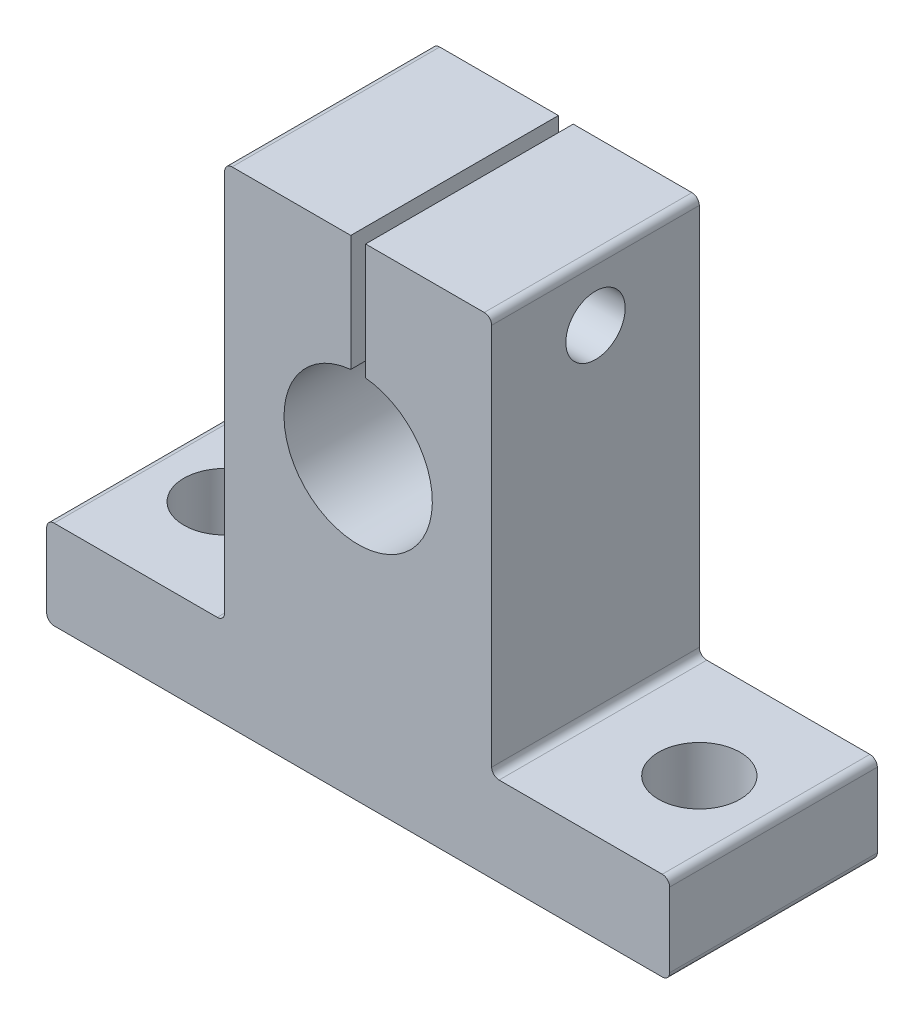
ISO-10303-21;
HEADER;
FILE_DESCRIPTION(('STEP AP214'),'2;1');
FILE_NAME('part.step','',(''),(''),'','','');
FILE_SCHEMA(('AUTOMOTIVE_DESIGN { 1 0 10303 214 1 1 1 1 }'));
ENDSEC;
DATA;
#1=APPLICATION_CONTEXT('core data for automotive mechanical design processes');
#2=APPLICATION_PROTOCOL_DEFINITION('international standard','automotive_design',2000,#1);
#3=PRODUCT_CONTEXT('',#1,'mechanical');
#4=PRODUCT('Part','Part','',(#3));
#5=PRODUCT_RELATED_PRODUCT_CATEGORY('part','',(#4));
#6=PRODUCT_DEFINITION_FORMATION('','',#4);
#7=PRODUCT_DEFINITION_CONTEXT('part definition',#1,'design');
#8=PRODUCT_DEFINITION('design','',#6,#7);
#9=PRODUCT_DEFINITION_SHAPE('','',#8);
#10=(LENGTH_UNIT() NAMED_UNIT(*) SI_UNIT(.MILLI.,.METRE.));
#11=(NAMED_UNIT(*) PLANE_ANGLE_UNIT() SI_UNIT($,.RADIAN.));
#12=(NAMED_UNIT(*) SI_UNIT($,.STERADIAN.) SOLID_ANGLE_UNIT());
#13=UNCERTAINTY_MEASURE_WITH_UNIT(LENGTH_MEASURE(1.E-05),#10,'distance_accuracy_value','');
#14=(GEOMETRIC_REPRESENTATION_CONTEXT(3) GLOBAL_UNCERTAINTY_ASSIGNED_CONTEXT((#13)) GLOBAL_UNIT_ASSIGNED_CONTEXT((#10,
#11,#12)) REPRESENTATION_CONTEXT('',''));
#15=CARTESIAN_POINT('',(0.,0.,0.));
#16=DIRECTION('',(0.,0.,1.));
#17=DIRECTION('',(1.,0.,0.));
#18=AXIS2_PLACEMENT_3D('',#15,#16,#17);
#19=CARTESIAN_POINT('',(0.5,13.4,7.));
#20=DIRECTION('',(0.,-1.,0.));
#21=DIRECTION('',(1.,0.,0.));
#22=AXIS2_PLACEMENT_3D('',#19,#20,#21);
#23=PLANE('',#22);
#24=DIRECTION('',(-1.,0.,0.));
#25=VECTOR('',#24,1.);
#26=CARTESIAN_POINT('',(0.5,13.4,7.));
#27=LINE('',#26,#25);
#28=CARTESIAN_POINT('',(8.5,13.4,7.));
#29=VERTEX_POINT('',#28);
#30=CARTESIAN_POINT('',(0.5,13.4,7.));
#31=VERTEX_POINT('',#30);
#32=EDGE_CURVE('E176',#29,#31,#27,.T.);
#33=ORIENTED_EDGE('',*,*,#32,.F.);
#34=DIRECTION('',(0.,0.,-1.));
#35=VECTOR('',#34,1.);
#36=CARTESIAN_POINT('',(8.5,13.4,7.));
#37=LINE('',#36,#35);
#38=CARTESIAN_POINT('',(8.5,13.4,-7.));
#39=VERTEX_POINT('',#38);
#40=EDGE_CURVE('E309',#29,#39,#37,.T.);
#41=ORIENTED_EDGE('',*,*,#40,.T.);
#42=DIRECTION('',(-1.,0.,0.));
#43=VECTOR('',#42,1.);
#44=CARTESIAN_POINT('',(0.5,13.4,-7.));
#45=LINE('',#44,#43);
#46=CARTESIAN_POINT('',(0.5,13.4,-7.));
#47=VERTEX_POINT('',#46);
#48=EDGE_CURVE('E202',#39,#47,#45,.T.);
#49=ORIENTED_EDGE('',*,*,#48,.T.);
#50=DIRECTION('',(0.,0.,-1.));
#51=VECTOR('',#50,1.);
#52=CARTESIAN_POINT('',(0.5,13.4,7.));
#53=LINE('',#52,#51);
#54=EDGE_CURVE('E194',#31,#47,#53,.T.);
#55=ORIENTED_EDGE('',*,*,#54,.F.);
#56=EDGE_LOOP('',(#33,#41,#49,#55));
#57=FACE_BOUND('',#56,.T.);
#58=ADVANCED_FACE('F39',(#57),#23,.F.);
#59=CARTESIAN_POINT('',(0.5,13.4,7.));
#60=DIRECTION('',(1.,0.,0.));
#61=DIRECTION('',(0.,1.,0.));
#62=AXIS2_PLACEMENT_3D('',#59,#60,#61);
#63=PLANE('',#62);
#64=CARTESIAN_POINT('',(0.5,9.4,0.));
#65=DIRECTION('',(1.,0.,0.));
#66=DIRECTION('',(0.,1.,0.));
#67=AXIS2_PLACEMENT_3D('',#64,#65,#66);
#68=CIRCLE('',#67,2.);
#69=CARTESIAN_POINT('',(0.5,11.4,0.));
#70=VERTEX_POINT('',#69);
#71=EDGE_CURVE('E441',#70,#70,#68,.F.);
#72=ORIENTED_EDGE('',*,*,#71,.F.);
#73=EDGE_LOOP('',(#72));
#74=FACE_BOUND('',#73,.T.);
#75=DIRECTION('',(0.,-1.,0.));
#76=VECTOR('',#75,1.);
#77=CARTESIAN_POINT('',(0.5,13.4,-7.));
#78=LINE('',#77,#76);
#79=CARTESIAN_POINT('',(0.5,5.57493718553311,-7.));
#80=VERTEX_POINT('',#79);
#81=EDGE_CURVE('E374',#47,#80,#78,.T.);
#82=ORIENTED_EDGE('',*,*,#81,.T.);
#83=DIRECTION('',(0.,0.,-1.));
#84=VECTOR('',#83,1.);
#85=CARTESIAN_POINT('',(0.5,5.57493718553311,7.));
#86=LINE('',#85,#84);
#87=CARTESIAN_POINT('',(0.5,5.57493718553311,7.));
#88=VERTEX_POINT('',#87);
#89=EDGE_CURVE('E196',#88,#80,#86,.T.);
#90=ORIENTED_EDGE('',*,*,#89,.F.);
#91=DIRECTION('',(0.,-1.,0.));
#92=VECTOR('',#91,1.);
#93=CARTESIAN_POINT('',(0.5,13.4,7.));
#94=LINE('',#93,#92);
#95=EDGE_CURVE('E180',#31,#88,#94,.T.);
#96=ORIENTED_EDGE('',*,*,#95,.F.);
#97=ORIENTED_EDGE('',*,*,#54,.T.);
#98=EDGE_LOOP('',(#82,#90,#96,#97));
#99=FACE_BOUND('',#98,.T.);
#100=ADVANCED_FACE('F193',(#74,#99),#63,.F.);
#101=CARTESIAN_POINT('',(0.,0.600000000000003,7.));
#102=DIRECTION('',(0.,0.,-1.));
#103=DIRECTION('',(-1.,0.,0.));
#104=AXIS2_PLACEMENT_3D('',#101,#102,#103);
#105=CYLINDRICAL_SURFACE('',#104,5.);
#106=CARTESIAN_POINT('',(0.,0.600000000000003,-7.));
#107=DIRECTION('',(0.,0.,-1.));
#108=DIRECTION('',(1.,0.,0.));
#109=AXIS2_PLACEMENT_3D('',#106,#107,#108);
#110=CIRCLE('',#109,5.);
#111=CARTESIAN_POINT('',(-0.499999999999999,5.57493718553311,-7.));
#112=VERTEX_POINT('',#111);
#113=EDGE_CURVE('E377',#80,#112,#110,.T.);
#114=ORIENTED_EDGE('',*,*,#113,.T.);
#115=DIRECTION('',(0.,0.,-1.));
#116=VECTOR('',#115,1.);
#117=CARTESIAN_POINT('',(-0.499999999999999,5.57493718553311,7.));
#118=LINE('',#117,#116);
#119=CARTESIAN_POINT('',(-0.499999999999999,5.57493718553311,7.));
#120=VERTEX_POINT('',#119);
#121=EDGE_CURVE('E211',#120,#112,#118,.T.);
#122=ORIENTED_EDGE('',*,*,#121,.F.);
#123=CARTESIAN_POINT('',(0.,0.600000000000003,7.));
#124=DIRECTION('',(0.,0.,-1.));
#125=DIRECTION('',(1.,0.,0.));
#126=AXIS2_PLACEMENT_3D('',#123,#124,#125);
#127=CIRCLE('',#126,5.);
#128=EDGE_CURVE('E199',#88,#120,#127,.T.);
#129=ORIENTED_EDGE('',*,*,#128,.F.);
#130=ORIENTED_EDGE('',*,*,#89,.T.);
#131=EDGE_LOOP('',(#114,#122,#129,#130));
#132=FACE_BOUND('',#131,.T.);
#133=ADVANCED_FACE('F465',(#132),#105,.F.);
#134=CARTESIAN_POINT('',(-0.5,13.4,7.));
#135=DIRECTION('',(-1.,0.,0.));
#136=DIRECTION('',(0.,-1.,0.));
#137=AXIS2_PLACEMENT_3D('',#134,#135,#136);
#138=PLANE('',#137);
#139=CARTESIAN_POINT('',(-0.5,9.4,0.));
#140=DIRECTION('',(-1.,0.,0.));
#141=DIRECTION('',(0.,-1.,0.));
#142=AXIS2_PLACEMENT_3D('',#139,#140,#141);
#143=CIRCLE('',#142,2.);
#144=CARTESIAN_POINT('',(-0.5,7.4,0.));
#145=VERTEX_POINT('',#144);
#146=EDGE_CURVE('E224',#145,#145,#143,.F.);
#147=ORIENTED_EDGE('',*,*,#146,.F.);
#148=EDGE_LOOP('',(#147));
#149=FACE_BOUND('',#148,.T.);
#150=DIRECTION('',(0.,1.,0.));
#151=VECTOR('',#150,1.);
#152=CARTESIAN_POINT('',(-0.5,13.4,-7.));
#153=LINE('',#152,#151);
#154=CARTESIAN_POINT('',(-0.5,13.4,-7.));
#155=VERTEX_POINT('',#154);
#156=EDGE_CURVE('E380',#112,#155,#153,.T.);
#157=ORIENTED_EDGE('',*,*,#156,.T.);
#158=DIRECTION('',(0.,0.,-1.));
#159=VECTOR('',#158,1.);
#160=CARTESIAN_POINT('',(-0.5,13.4,7.));
#161=LINE('',#160,#159);
#162=CARTESIAN_POINT('',(-0.5,13.4,7.));
#163=VERTEX_POINT('',#162);
#164=EDGE_CURVE('E371',#163,#155,#161,.T.);
#165=ORIENTED_EDGE('',*,*,#164,.F.);
#166=DIRECTION('',(0.,1.,0.));
#167=VECTOR('',#166,1.);
#168=CARTESIAN_POINT('',(-0.5,13.4,7.));
#169=LINE('',#168,#167);
#170=EDGE_CURVE('E416',#120,#163,#169,.T.);
#171=ORIENTED_EDGE('',*,*,#170,.F.);
#172=ORIENTED_EDGE('',*,*,#121,.T.);
#173=EDGE_LOOP('',(#157,#165,#171,#172));
#174=FACE_BOUND('',#173,.T.);
#175=ADVANCED_FACE('F414',(#149,#174),#138,.F.);
#176=CARTESIAN_POINT('',(-9.,13.4,7.));
#177=DIRECTION('',(0.,-1.,0.));
#178=DIRECTION('',(1.,0.,0.));
#179=AXIS2_PLACEMENT_3D('',#176,#177,#178);
#180=PLANE('',#179);
#181=DIRECTION('',(-1.,0.,0.));
#182=VECTOR('',#181,1.);
#183=CARTESIAN_POINT('',(-9.,13.4,-7.));
#184=LINE('',#183,#182);
#185=CARTESIAN_POINT('',(-8.5,13.4,-7.));
#186=VERTEX_POINT('',#185);
#187=EDGE_CURVE('E335',#155,#186,#184,.T.);
#188=ORIENTED_EDGE('',*,*,#187,.T.);
#189=DIRECTION('',(0.,0.,-1.));
#190=VECTOR('',#189,1.);
#191=CARTESIAN_POINT('',(-8.5,13.4,7.));
#192=LINE('',#191,#190);
#193=CARTESIAN_POINT('',(-8.5,13.4,7.));
#194=VERTEX_POINT('',#193);
#195=EDGE_CURVE('E306',#186,#194,#192,.F.);
#196=ORIENTED_EDGE('',*,*,#195,.T.);
#197=DIRECTION('',(-1.,0.,0.));
#198=VECTOR('',#197,1.);
#199=CARTESIAN_POINT('',(-9.,13.4,7.));
#200=LINE('',#199,#198);
#201=EDGE_CURVE('E355',#163,#194,#200,.T.);
#202=ORIENTED_EDGE('',*,*,#201,.F.);
#203=ORIENTED_EDGE('',*,*,#164,.T.);
#204=EDGE_LOOP('',(#188,#196,#202,#203));
#205=FACE_BOUND('',#204,.T.);
#206=ADVANCED_FACE('F422',(#205),#180,.F.);
#207=CARTESIAN_POINT('',(-9.,-13.4,7.));
#208=DIRECTION('',(1.,0.,0.));
#209=DIRECTION('',(0.,1.,0.));
#210=AXIS2_PLACEMENT_3D('',#207,#208,#209);
#211=PLANE('',#210);
#212=DIRECTION('',(0.,-1.,0.));
#213=VECTOR('',#212,1.);
#214=CARTESIAN_POINT('',(-9.,-13.4,-7.));
#215=LINE('',#214,#213);
#216=CARTESIAN_POINT('',(-9.,12.9,-7.));
#217=VERTEX_POINT('',#216);
#218=CARTESIAN_POINT('',(-9.,-12.9,-7.));
#219=VERTEX_POINT('',#218);
#220=EDGE_CURVE('E323',#217,#219,#215,.T.);
#221=ORIENTED_EDGE('',*,*,#220,.T.);
#222=DIRECTION('',(0.,0.,-1.));
#223=VECTOR('',#222,1.);
#224=CARTESIAN_POINT('',(-9.,-12.9,7.));
#225=LINE('',#224,#223);
#226=CARTESIAN_POINT('',(-9.,-12.9,7.));
#227=VERTEX_POINT('',#226);
#228=EDGE_CURVE('E303',#219,#227,#225,.F.);
#229=ORIENTED_EDGE('',*,*,#228,.T.);
#230=DIRECTION('',(0.,-1.,0.));
#231=VECTOR('',#230,1.);
#232=CARTESIAN_POINT('',(-9.,-13.4,7.));
#233=LINE('',#232,#231);
#234=CARTESIAN_POINT('',(-9.,12.9,7.));
#235=VERTEX_POINT('',#234);
#236=EDGE_CURVE('E343',#235,#227,#233,.T.);
#237=ORIENTED_EDGE('',*,*,#236,.F.);
#238=DIRECTION('',(0.,0.,-1.));
#239=VECTOR('',#238,1.);
#240=CARTESIAN_POINT('',(-9.,12.9,7.));
#241=LINE('',#240,#239);
#242=EDGE_CURVE('E299',#235,#217,#241,.T.);
#243=ORIENTED_EDGE('',*,*,#242,.T.);
#244=EDGE_LOOP('',(#221,#229,#237,#243));
#245=FACE_BOUND('',#244,.T.);
#246=ADVANCED_FACE('F330',(#245),#211,.F.);
#247=CARTESIAN_POINT('',(-9.,-13.4,7.));
#248=DIRECTION('',(0.,-1.,0.));
#249=DIRECTION('',(1.,0.,0.));
#250=AXIS2_PLACEMENT_3D('',#247,#248,#249);
#251=PLANE('',#250);
#252=CARTESIAN_POINT('',(-16.,-13.4,0.));
#253=DIRECTION('',(0.,-1.,0.));
#254=DIRECTION('',(1.,0.,0.));
#255=AXIS2_PLACEMENT_3D('',#252,#253,#254);
#256=CIRCLE('',#255,2.75);
#257=CARTESIAN_POINT('',(-13.25,-13.4,0.));
#258=VERTEX_POINT('',#257);
#259=EDGE_CURVE('E219',#258,#258,#256,.T.);
#260=ORIENTED_EDGE('',*,*,#259,.T.);
#261=EDGE_LOOP('',(#260));
#262=FACE_BOUND('',#261,.T.);
#263=DIRECTION('',(-1.,0.,0.));
#264=VECTOR('',#263,1.);
#265=CARTESIAN_POINT('',(-9.,-13.4,-7.));
#266=LINE('',#265,#264);
#267=CARTESIAN_POINT('',(-9.5,-13.4,-7.));
#268=VERTEX_POINT('',#267);
#269=CARTESIAN_POINT('',(-20.5,-13.4,-7.));
#270=VERTEX_POINT('',#269);
#271=EDGE_CURVE('E325',#268,#270,#266,.T.);
#272=ORIENTED_EDGE('',*,*,#271,.T.);
#273=DIRECTION('',(0.,0.,-1.));
#274=VECTOR('',#273,1.);
#275=CARTESIAN_POINT('',(-20.5,-13.4,7.));
#276=LINE('',#275,#274);
#277=CARTESIAN_POINT('',(-20.5,-13.4,7.));
#278=VERTEX_POINT('',#277);
#279=EDGE_CURVE('E296',#270,#278,#276,.F.);
#280=ORIENTED_EDGE('',*,*,#279,.T.);
#281=DIRECTION('',(-1.,0.,0.));
#282=VECTOR('',#281,1.);
#283=CARTESIAN_POINT('',(-9.,-13.4,7.));
#284=LINE('',#283,#282);
#285=CARTESIAN_POINT('',(-9.5,-13.4,7.));
#286=VERTEX_POINT('',#285);
#287=EDGE_CURVE('E341',#286,#278,#284,.T.);
#288=ORIENTED_EDGE('',*,*,#287,.F.);
#289=DIRECTION('',(0.,0.,-1.));
#290=VECTOR('',#289,1.);
#291=CARTESIAN_POINT('',(-9.5,-13.4,-7.));
#292=LINE('',#291,#290);
#293=EDGE_CURVE('E292',#286,#268,#292,.T.);
#294=ORIENTED_EDGE('',*,*,#293,.T.);
#295=EDGE_LOOP('',(#272,#280,#288,#294));
#296=FACE_BOUND('',#295,.T.);
#297=ADVANCED_FACE('F345',(#262,#296),#251,.F.);
#298=CARTESIAN_POINT('',(-21.,-13.4,7.));
#299=DIRECTION('',(1.,0.,0.));
#300=DIRECTION('',(0.,0.,-1.));
#301=AXIS2_PLACEMENT_3D('',#298,#299,#300);
#302=PLANE('',#301);
#303=DIRECTION('',(0.,-1.,0.));
#304=VECTOR('',#303,1.);
#305=CARTESIAN_POINT('',(-21.,-13.4,-7.));
#306=LINE('',#305,#304);
#307=CARTESIAN_POINT('',(-21.,-13.9,-7.));
#308=VERTEX_POINT('',#307);
#309=CARTESIAN_POINT('',(-21.,-18.9,-7.));
#310=VERTEX_POINT('',#309);
#311=EDGE_CURVE('E388',#308,#310,#306,.T.);
#312=ORIENTED_EDGE('',*,*,#311,.T.);
#313=DIRECTION('',(0.,0.,-1.));
#314=VECTOR('',#313,1.);
#315=CARTESIAN_POINT('',(-21.,-18.9,7.));
#316=LINE('',#315,#314);
#317=CARTESIAN_POINT('',(-21.,-18.9,7.));
#318=VERTEX_POINT('',#317);
#319=EDGE_CURVE('E289',#310,#318,#316,.F.);
#320=ORIENTED_EDGE('',*,*,#319,.T.);
#321=DIRECTION('',(0.,-1.,0.));
#322=VECTOR('',#321,1.);
#323=CARTESIAN_POINT('',(-21.,-13.4,7.));
#324=LINE('',#323,#322);
#325=CARTESIAN_POINT('',(-21.,-13.9,7.));
#326=VERTEX_POINT('',#325);
#327=EDGE_CURVE('E348',#326,#318,#324,.T.);
#328=ORIENTED_EDGE('',*,*,#327,.F.);
#329=DIRECTION('',(0.,0.,-1.));
#330=VECTOR('',#329,1.);
#331=CARTESIAN_POINT('',(-21.,-13.9,7.));
#332=LINE('',#331,#330);
#333=EDGE_CURVE('E285',#326,#308,#332,.T.);
#334=ORIENTED_EDGE('',*,*,#333,.T.);
#335=EDGE_LOOP('',(#312,#320,#328,#334));
#336=FACE_BOUND('',#335,.T.);
#337=ADVANCED_FACE('F535',(#336),#302,.F.);
#338=CARTESIAN_POINT('',(-21.,-19.4,7.));
#339=DIRECTION('',(0.,1.,0.));
#340=DIRECTION('',(-1.,0.,0.));
#341=AXIS2_PLACEMENT_3D('',#338,#339,#340);
#342=PLANE('',#341);
#343=CARTESIAN_POINT('',(-16.,-19.4,0.));
#344=DIRECTION('',(0.,1.,0.));
#345=DIRECTION('',(0.,0.,1.));
#346=AXIS2_PLACEMENT_3D('',#343,#344,#345);
#347=CIRCLE('',#346,2.75);
#348=CARTESIAN_POINT('',(-16.,-19.4,2.75));
#349=VERTEX_POINT('',#348);
#350=EDGE_CURVE('E220',#349,#349,#347,.T.);
#351=ORIENTED_EDGE('',*,*,#350,.T.);
#352=EDGE_LOOP('',(#351));
#353=FACE_BOUND('',#352,.T.);
#354=CARTESIAN_POINT('',(16.,-19.4,0.));
#355=DIRECTION('',(0.,1.,0.));
#356=DIRECTION('',(0.,0.,-1.));
#357=AXIS2_PLACEMENT_3D('',#354,#355,#356);
#358=CIRCLE('',#357,2.75);
#359=CARTESIAN_POINT('',(16.,-19.4,-2.75));
#360=VERTEX_POINT('',#359);
#361=EDGE_CURVE('E437',#360,#360,#358,.T.);
#362=ORIENTED_EDGE('',*,*,#361,.T.);
#363=EDGE_LOOP('',(#362));
#364=FACE_BOUND('',#363,.T.);
#365=DIRECTION('',(1.,0.,0.));
#366=VECTOR('',#365,1.);
#367=CARTESIAN_POINT('',(-21.,-19.4,-7.));
#368=LINE('',#367,#366);
#369=CARTESIAN_POINT('',(-20.5,-19.4,-7.));
#370=VERTEX_POINT('',#369);
#371=CARTESIAN_POINT('',(20.5,-19.4,-7.));
#372=VERTEX_POINT('',#371);
#373=EDGE_CURVE('E392',#370,#372,#368,.T.);
#374=ORIENTED_EDGE('',*,*,#373,.T.);
#375=DIRECTION('',(0.,0.,-1.));
#376=VECTOR('',#375,1.);
#377=CARTESIAN_POINT('',(20.5,-19.4,7.));
#378=LINE('',#377,#376);
#379=CARTESIAN_POINT('',(20.5,-19.4,7.));
#380=VERTEX_POINT('',#379);
#381=EDGE_CURVE('E252',#372,#380,#378,.F.);
#382=ORIENTED_EDGE('',*,*,#381,.T.);
#383=DIRECTION('',(1.,0.,0.));
#384=VECTOR('',#383,1.);
#385=CARTESIAN_POINT('',(-21.,-19.4,7.));
#386=LINE('',#385,#384);
#387=CARTESIAN_POINT('',(-20.5,-19.4,7.));
#388=VERTEX_POINT('',#387);
#389=EDGE_CURVE('E353',#388,#380,#386,.T.);
#390=ORIENTED_EDGE('',*,*,#389,.F.);
#391=DIRECTION('',(0.,0.,-1.));
#392=VECTOR('',#391,1.);
#393=CARTESIAN_POINT('',(-20.5,-19.4,7.));
#394=LINE('',#393,#392);
#395=EDGE_CURVE('E248',#388,#370,#394,.T.);
#396=ORIENTED_EDGE('',*,*,#395,.T.);
#397=EDGE_LOOP('',(#374,#382,#390,#396));
#398=FACE_BOUND('',#397,.T.);
#399=ADVANCED_FACE('F528',(#353,#364,#398),#342,.F.);
#400=CARTESIAN_POINT('',(21.,-13.4,7.));
#401=DIRECTION('',(-1.,0.,0.));
#402=DIRECTION('',(0.,0.,1.));
#403=AXIS2_PLACEMENT_3D('',#400,#401,#402);
#404=PLANE('',#403);
#405=DIRECTION('',(0.,1.,0.));
#406=VECTOR('',#405,1.);
#407=CARTESIAN_POINT('',(21.,-13.4,7.));
#408=LINE('',#407,#406);
#409=CARTESIAN_POINT('',(21.,-18.9,7.));
#410=VERTEX_POINT('',#409);
#411=CARTESIAN_POINT('',(21.,-13.9,7.));
#412=VERTEX_POINT('',#411);
#413=EDGE_CURVE('E361',#410,#412,#408,.T.);
#414=ORIENTED_EDGE('',*,*,#413,.F.);
#415=DIRECTION('',(0.,0.,-1.));
#416=VECTOR('',#415,1.);
#417=CARTESIAN_POINT('',(21.,-18.9,7.));
#418=LINE('',#417,#416);
#419=CARTESIAN_POINT('',(21.,-18.9,-7.));
#420=VERTEX_POINT('',#419);
#421=EDGE_CURVE('E209',#410,#420,#418,.T.);
#422=ORIENTED_EDGE('',*,*,#421,.T.);
#423=DIRECTION('',(0.,1.,0.));
#424=VECTOR('',#423,1.);
#425=CARTESIAN_POINT('',(21.,-13.4,-7.));
#426=LINE('',#425,#424);
#427=CARTESIAN_POINT('',(21.,-13.9,-7.));
#428=VERTEX_POINT('',#427);
#429=EDGE_CURVE('E396',#420,#428,#426,.T.);
#430=ORIENTED_EDGE('',*,*,#429,.T.);
#431=DIRECTION('',(0.,0.,-1.));
#432=VECTOR('',#431,1.);
#433=CARTESIAN_POINT('',(21.,-13.9,7.));
#434=LINE('',#433,#432);
#435=EDGE_CURVE('E205',#428,#412,#434,.F.);
#436=ORIENTED_EDGE('',*,*,#435,.T.);
#437=EDGE_LOOP('',(#414,#422,#430,#436));
#438=FACE_BOUND('',#437,.T.);
#439=ADVANCED_FACE('F522',(#438),#404,.F.);
#440=CARTESIAN_POINT('',(9.,-13.4,7.));
#441=DIRECTION('',(0.,-1.,0.));
#442=DIRECTION('',(1.,0.,0.));
#443=AXIS2_PLACEMENT_3D('',#440,#441,#442);
#444=PLANE('',#443);
#445=CARTESIAN_POINT('',(16.,-13.4,0.));
#446=DIRECTION('',(0.,-1.,0.));
#447=DIRECTION('',(1.,0.,0.));
#448=AXIS2_PLACEMENT_3D('',#445,#446,#447);
#449=CIRCLE('',#448,2.75);
#450=CARTESIAN_POINT('',(18.75,-13.4,0.));
#451=VERTEX_POINT('',#450);
#452=EDGE_CURVE('E215',#451,#451,#449,.T.);
#453=ORIENTED_EDGE('',*,*,#452,.T.);
#454=EDGE_LOOP('',(#453));
#455=FACE_BOUND('',#454,.T.);
#456=DIRECTION('',(-1.,0.,0.));
#457=VECTOR('',#456,1.);
#458=CARTESIAN_POINT('',(9.,-13.4,7.));
#459=LINE('',#458,#457);
#460=CARTESIAN_POINT('',(20.5,-13.4,7.));
#461=VERTEX_POINT('',#460);
#462=CARTESIAN_POINT('',(9.5,-13.4,7.));
#463=VERTEX_POINT('',#462);
#464=EDGE_CURVE('E365',#461,#463,#459,.T.);
#465=ORIENTED_EDGE('',*,*,#464,.F.);
#466=DIRECTION('',(0.,0.,-1.));
#467=VECTOR('',#466,1.);
#468=CARTESIAN_POINT('',(20.5,-13.4,7.));
#469=LINE('',#468,#467);
#470=CARTESIAN_POINT('',(20.5,-13.4,-7.));
#471=VERTEX_POINT('',#470);
#472=EDGE_CURVE('E275',#461,#471,#469,.T.);
#473=ORIENTED_EDGE('',*,*,#472,.T.);
#474=DIRECTION('',(-1.,0.,0.));
#475=VECTOR('',#474,1.);
#476=CARTESIAN_POINT('',(9.,-13.4,-7.));
#477=LINE('',#476,#475);
#478=CARTESIAN_POINT('',(9.5,-13.4,-7.));
#479=VERTEX_POINT('',#478);
#480=EDGE_CURVE('E400',#471,#479,#477,.T.);
#481=ORIENTED_EDGE('',*,*,#480,.T.);
#482=DIRECTION('',(0.,0.,-1.));
#483=VECTOR('',#482,1.);
#484=CARTESIAN_POINT('',(9.5,-13.4,7.));
#485=LINE('',#484,#483);
#486=EDGE_CURVE('E272',#479,#463,#485,.F.);
#487=ORIENTED_EDGE('',*,*,#486,.T.);
#488=EDGE_LOOP('',(#465,#473,#481,#487));
#489=FACE_BOUND('',#488,.T.);
#490=ADVANCED_FACE('F516',(#455,#489),#444,.F.);
#491=CARTESIAN_POINT('',(9.,-13.4,7.));
#492=DIRECTION('',(-1.,0.,0.));
#493=DIRECTION('',(0.,0.,1.));
#494=AXIS2_PLACEMENT_3D('',#491,#492,#493);
#495=PLANE('',#494);
#496=CARTESIAN_POINT('',(9.,9.4,0.));
#497=DIRECTION('',(-1.,0.,0.));
#498=DIRECTION('',(0.,0.,1.));
#499=AXIS2_PLACEMENT_3D('',#496,#497,#498);
#500=CIRCLE('',#499,2.);
#501=CARTESIAN_POINT('',(9.,9.4,2.));
#502=VERTEX_POINT('',#501);
#503=EDGE_CURVE('E221',#502,#502,#500,.F.);
#504=ORIENTED_EDGE('',*,*,#503,.F.);
#505=EDGE_LOOP('',(#504));
#506=FACE_BOUND('',#505,.T.);
#507=DIRECTION('',(0.,1.,0.));
#508=VECTOR('',#507,1.);
#509=CARTESIAN_POINT('',(9.,-13.4,7.));
#510=LINE('',#509,#508);
#511=CARTESIAN_POINT('',(9.,-12.9,7.));
#512=VERTEX_POINT('',#511);
#513=CARTESIAN_POINT('',(9.,12.9,7.));
#514=VERTEX_POINT('',#513);
#515=EDGE_CURVE('E368',#512,#514,#510,.T.);
#516=ORIENTED_EDGE('',*,*,#515,.F.);
#517=DIRECTION('',(0.,0.,-1.));
#518=VECTOR('',#517,1.);
#519=CARTESIAN_POINT('',(9.,-12.9,-7.));
#520=LINE('',#519,#518);
#521=CARTESIAN_POINT('',(9.,-12.9,-7.));
#522=VERTEX_POINT('',#521);
#523=EDGE_CURVE('E281',#512,#522,#520,.T.);
#524=ORIENTED_EDGE('',*,*,#523,.T.);
#525=DIRECTION('',(0.,1.,0.));
#526=VECTOR('',#525,1.);
#527=CARTESIAN_POINT('',(9.,-13.4,-7.));
#528=LINE('',#527,#526);
#529=CARTESIAN_POINT('',(9.,12.9,-7.));
#530=VERTEX_POINT('',#529);
#531=EDGE_CURVE('E189',#522,#530,#528,.T.);
#532=ORIENTED_EDGE('',*,*,#531,.T.);
#533=DIRECTION('',(0.,0.,-1.));
#534=VECTOR('',#533,1.);
#535=CARTESIAN_POINT('',(9.,12.9,7.));
#536=LINE('',#535,#534);
#537=EDGE_CURVE('E55',#530,#514,#536,.F.);
#538=ORIENTED_EDGE('',*,*,#537,.T.);
#539=EDGE_LOOP('',(#516,#524,#532,#538));
#540=FACE_BOUND('',#539,.T.);
#541=ADVANCED_FACE('F510',(#506,#540),#495,.F.);
#542=CARTESIAN_POINT('',(0.,0.600000000000003,7.));
#543=DIRECTION('',(0.,0.,1.));
#544=DIRECTION('',(1.,0.,0.));
#545=AXIS2_PLACEMENT_3D('',#542,#543,#544);
#546=PLANE('',#545);
#547=ORIENTED_EDGE('',*,*,#389,.T.);
#548=CARTESIAN_POINT('',(20.5,-18.9,7.));
#549=DIRECTION('',(0.,0.,1.));
#550=DIRECTION('',(1.,0.,0.));
#551=AXIS2_PLACEMENT_3D('',#548,#549,#550);
#552=CIRCLE('',#551,0.5);
#553=EDGE_CURVE('E269',#380,#410,#552,.T.);
#554=ORIENTED_EDGE('',*,*,#553,.T.);
#555=ORIENTED_EDGE('',*,*,#413,.T.);
#556=CARTESIAN_POINT('',(20.5,-13.9,7.));
#557=DIRECTION('',(0.,0.,1.));
#558=DIRECTION('',(1.,0.,0.));
#559=AXIS2_PLACEMENT_3D('',#556,#557,#558);
#560=CIRCLE('',#559,0.5);
#561=EDGE_CURVE('E266',#412,#461,#560,.T.);
#562=ORIENTED_EDGE('',*,*,#561,.T.);
#563=ORIENTED_EDGE('',*,*,#464,.T.);
#564=CARTESIAN_POINT('',(9.5,-12.9,7.));
#565=DIRECTION('',(0.,0.,1.));
#566=DIRECTION('',(1.,0.,0.));
#567=AXIS2_PLACEMENT_3D('',#564,#565,#566);
#568=CIRCLE('',#567,0.5);
#569=EDGE_CURVE('E62',#463,#512,#568,.F.);
#570=ORIENTED_EDGE('',*,*,#569,.T.);
#571=ORIENTED_EDGE('',*,*,#515,.T.);
#572=CARTESIAN_POINT('',(8.5,12.9,7.));
#573=DIRECTION('',(0.,0.,1.));
#574=DIRECTION('',(1.,0.,0.));
#575=AXIS2_PLACEMENT_3D('',#572,#573,#574);
#576=CIRCLE('',#575,0.5);
#577=EDGE_CURVE('E183',#514,#29,#576,.T.);
#578=ORIENTED_EDGE('',*,*,#577,.T.);
#579=ORIENTED_EDGE('',*,*,#32,.T.);
#580=ORIENTED_EDGE('',*,*,#95,.T.);
#581=ORIENTED_EDGE('',*,*,#128,.T.);
#582=ORIENTED_EDGE('',*,*,#170,.T.);
#583=ORIENTED_EDGE('',*,*,#201,.T.);
#584=CARTESIAN_POINT('',(-8.5,12.9,7.));
#585=DIRECTION('',(0.,0.,1.));
#586=DIRECTION('',(1.,0.,0.));
#587=AXIS2_PLACEMENT_3D('',#584,#585,#586);
#588=CIRCLE('',#587,0.5);
#589=EDGE_CURVE('E257',#194,#235,#588,.T.);
#590=ORIENTED_EDGE('',*,*,#589,.T.);
#591=ORIENTED_EDGE('',*,*,#236,.T.);
#592=CARTESIAN_POINT('',(-9.5,-12.9,7.));
#593=DIRECTION('',(0.,0.,1.));
#594=DIRECTION('',(1.,0.,0.));
#595=AXIS2_PLACEMENT_3D('',#592,#593,#594);
#596=CIRCLE('',#595,0.5);
#597=EDGE_CURVE('E11',#227,#286,#596,.F.);
#598=ORIENTED_EDGE('',*,*,#597,.T.);
#599=ORIENTED_EDGE('',*,*,#287,.T.);
#600=CARTESIAN_POINT('',(-20.5,-13.9,7.));
#601=DIRECTION('',(0.,0.,1.));
#602=DIRECTION('',(1.,0.,0.));
#603=AXIS2_PLACEMENT_3D('',#600,#601,#602);
#604=CIRCLE('',#603,0.5);
#605=EDGE_CURVE('E260',#278,#326,#604,.T.);
#606=ORIENTED_EDGE('',*,*,#605,.T.);
#607=ORIENTED_EDGE('',*,*,#327,.T.);
#608=CARTESIAN_POINT('',(-20.5,-18.9,7.));
#609=DIRECTION('',(0.,0.,1.));
#610=DIRECTION('',(1.,0.,0.));
#611=AXIS2_PLACEMENT_3D('',#608,#609,#610);
#612=CIRCLE('',#611,0.5);
#613=EDGE_CURVE('E263',#318,#388,#612,.T.);
#614=ORIENTED_EDGE('',*,*,#613,.T.);
#615=EDGE_LOOP('',(#547,#554,#555,#562,#563,#570,#571,#578,#579,#580,#581,#582,#583,#590,#591,
#598,#599,#606,#607,#614));
#616=FACE_BOUND('',#615,.T.);
#617=ADVANCED_FACE('F179',(#616),#546,.T.);
#618=CARTESIAN_POINT('',(0.,0.600000000000003,-7.));
#619=DIRECTION('',(0.,0.,1.));
#620=DIRECTION('',(1.,0.,0.));
#621=AXIS2_PLACEMENT_3D('',#618,#619,#620);
#622=PLANE('',#621);
#623=ORIENTED_EDGE('',*,*,#429,.F.);
#624=CARTESIAN_POINT('',(20.5,-18.9,-7.));
#625=DIRECTION('',(0.,0.,1.));
#626=DIRECTION('',(1.,0.,0.));
#627=AXIS2_PLACEMENT_3D('',#624,#625,#626);
#628=CIRCLE('',#627,0.5);
#629=EDGE_CURVE('E245',#420,#372,#628,.F.);
#630=ORIENTED_EDGE('',*,*,#629,.T.);
#631=ORIENTED_EDGE('',*,*,#373,.F.);
#632=CARTESIAN_POINT('',(-20.5,-18.9,-7.));
#633=DIRECTION('',(0.,0.,1.));
#634=DIRECTION('',(1.,0.,0.));
#635=AXIS2_PLACEMENT_3D('',#632,#633,#634);
#636=CIRCLE('',#635,0.5);
#637=EDGE_CURVE('E239',#370,#310,#636,.F.);
#638=ORIENTED_EDGE('',*,*,#637,.T.);
#639=ORIENTED_EDGE('',*,*,#311,.F.);
#640=CARTESIAN_POINT('',(-20.5,-13.9,-7.));
#641=DIRECTION('',(0.,0.,1.));
#642=DIRECTION('',(1.,0.,0.));
#643=AXIS2_PLACEMENT_3D('',#640,#641,#642);
#644=CIRCLE('',#643,0.5);
#645=EDGE_CURVE('E236',#308,#270,#644,.F.);
#646=ORIENTED_EDGE('',*,*,#645,.T.);
#647=ORIENTED_EDGE('',*,*,#271,.F.);
#648=CARTESIAN_POINT('',(-9.5,-12.9,-7.));
#649=DIRECTION('',(0.,0.,1.));
#650=DIRECTION('',(1.,0.,0.));
#651=AXIS2_PLACEMENT_3D('',#648,#649,#650);
#652=CIRCLE('',#651,0.5);
#653=EDGE_CURVE('E48',#268,#219,#652,.T.);
#654=ORIENTED_EDGE('',*,*,#653,.T.);
#655=ORIENTED_EDGE('',*,*,#220,.F.);
#656=CARTESIAN_POINT('',(-8.5,12.9,-7.));
#657=DIRECTION('',(0.,0.,1.));
#658=DIRECTION('',(1.,0.,0.));
#659=AXIS2_PLACEMENT_3D('',#656,#657,#658);
#660=CIRCLE('',#659,0.5);
#661=EDGE_CURVE('E233',#217,#186,#660,.F.);
#662=ORIENTED_EDGE('',*,*,#661,.T.);
#663=ORIENTED_EDGE('',*,*,#187,.F.);
#664=ORIENTED_EDGE('',*,*,#156,.F.);
#665=ORIENTED_EDGE('',*,*,#113,.F.);
#666=ORIENTED_EDGE('',*,*,#81,.F.);
#667=ORIENTED_EDGE('',*,*,#48,.F.);
#668=CARTESIAN_POINT('',(8.5,12.9,-7.));
#669=DIRECTION('',(0.,0.,1.));
#670=DIRECTION('',(1.,0.,0.));
#671=AXIS2_PLACEMENT_3D('',#668,#669,#670);
#672=CIRCLE('',#671,0.5);
#673=EDGE_CURVE('E230',#39,#530,#672,.F.);
#674=ORIENTED_EDGE('',*,*,#673,.T.);
#675=ORIENTED_EDGE('',*,*,#531,.F.);
#676=CARTESIAN_POINT('',(9.5,-12.9,-7.));
#677=DIRECTION('',(0.,0.,1.));
#678=DIRECTION('',(1.,0.,0.));
#679=AXIS2_PLACEMENT_3D('',#676,#677,#678);
#680=CIRCLE('',#679,0.5);
#681=EDGE_CURVE('E312',#522,#479,#680,.T.);
#682=ORIENTED_EDGE('',*,*,#681,.T.);
#683=ORIENTED_EDGE('',*,*,#480,.F.);
#684=CARTESIAN_POINT('',(20.5,-13.9,-7.));
#685=DIRECTION('',(0.,0.,1.));
#686=DIRECTION('',(1.,0.,0.));
#687=AXIS2_PLACEMENT_3D('',#684,#685,#686);
#688=CIRCLE('',#687,0.5);
#689=EDGE_CURVE('E242',#471,#428,#688,.F.);
#690=ORIENTED_EDGE('',*,*,#689,.T.);
#691=EDGE_LOOP('',(#623,#630,#631,#638,#639,#646,#647,#654,#655,#662,#663,#664,#665,#666,#667,
#674,#675,#682,#683,#690));
#692=FACE_BOUND('',#691,.T.);
#693=ADVANCED_FACE('F322',(#692),#622,.F.);
#694=CARTESIAN_POINT('',(16.,-19.4,0.));
#695=DIRECTION('',(0.,1.,0.));
#696=DIRECTION('',(0.,0.,1.));
#697=AXIS2_PLACEMENT_3D('',#694,#695,#696);
#698=CYLINDRICAL_SURFACE('',#697,2.75);
#699=ORIENTED_EDGE('',*,*,#361,.F.);
#700=EDGE_LOOP('',(#699));
#701=FACE_BOUND('',#700,.T.);
#702=ORIENTED_EDGE('',*,*,#452,.F.);
#703=EDGE_LOOP('',(#702));
#704=FACE_BOUND('',#703,.T.);
#705=ADVANCED_FACE('F611',(#701,#704),#698,.F.);
#706=CARTESIAN_POINT('',(-16.,-19.4,0.));
#707=DIRECTION('',(0.,1.,0.));
#708=DIRECTION('',(0.,0.,1.));
#709=AXIS2_PLACEMENT_3D('',#706,#707,#708);
#710=CYLINDRICAL_SURFACE('',#709,2.75);
#711=ORIENTED_EDGE('',*,*,#350,.F.);
#712=EDGE_LOOP('',(#711));
#713=FACE_BOUND('',#712,.T.);
#714=ORIENTED_EDGE('',*,*,#259,.F.);
#715=EDGE_LOOP('',(#714));
#716=FACE_BOUND('',#715,.T.);
#717=ADVANCED_FACE('F675',(#713,#716),#710,.F.);
#718=CARTESIAN_POINT('',(21.,9.4,0.));
#719=DIRECTION('',(-1.,0.,0.));
#720=DIRECTION('',(0.,0.,1.));
#721=AXIS2_PLACEMENT_3D('',#718,#719,#720);
#722=CYLINDRICAL_SURFACE('',#721,2.);
#723=ORIENTED_EDGE('',*,*,#503,.T.);
#724=EDGE_LOOP('',(#723));
#725=FACE_BOUND('',#724,.T.);
#726=ORIENTED_EDGE('',*,*,#71,.T.);
#727=EDGE_LOOP('',(#726));
#728=FACE_BOUND('',#727,.T.);
#729=ADVANCED_FACE('F460',(#725,#728),#722,.F.);
#730=CARTESIAN_POINT('',(-5.99999999999999,9.4,0.));
#731=DIRECTION('',(1.,0.,0.));
#732=DIRECTION('',(0.,0.,-1.));
#733=AXIS2_PLACEMENT_3D('',#730,#731,#732);
#734=CIRCLE('',#733,2.);
#735=CARTESIAN_POINT('',(-5.99999999999999,9.4,-2.));
#736=VERTEX_POINT('',#735);
#737=EDGE_CURVE('E225',#736,#736,#734,.T.);
#738=ORIENTED_EDGE('',*,*,#737,.F.);
#739=EDGE_LOOP('',(#738));
#740=FACE_BOUND('',#739,.T.);
#741=ORIENTED_EDGE('',*,*,#146,.T.);
#742=EDGE_LOOP('',(#741));
#743=FACE_BOUND('',#742,.T.);
#744=ADVANCED_FACE('F457',(#740,#743),#722,.F.);
#745=CARTESIAN_POINT('',(-5.99999999999999,9.4,0.));
#746=DIRECTION('',(1.,0.,0.));
#747=DIRECTION('',(0.,0.,-1.));
#748=AXIS2_PLACEMENT_3D('',#745,#746,#747);
#749=PLANE('',#748);
#750=ORIENTED_EDGE('',*,*,#737,.T.);
#751=EDGE_LOOP('',(#750));
#752=FACE_BOUND('',#751,.T.);
#753=ADVANCED_FACE('F455',(#752),#749,.T.);
#754=CARTESIAN_POINT('',(20.5,-18.9,7.));
#755=DIRECTION('',(0.,0.,-1.));
#756=DIRECTION('',(-1.,0.,0.));
#757=AXIS2_PLACEMENT_3D('',#754,#755,#756);
#758=CYLINDRICAL_SURFACE('',#757,0.5);
#759=ORIENTED_EDGE('',*,*,#553,.F.);
#760=ORIENTED_EDGE('',*,*,#381,.F.);
#761=ORIENTED_EDGE('',*,*,#629,.F.);
#762=ORIENTED_EDGE('',*,*,#421,.F.);
#763=EDGE_LOOP('',(#759,#760,#761,#762));
#764=FACE_BOUND('',#763,.T.);
#765=ADVANCED_FACE('F481',(#764),#758,.T.);
#766=CARTESIAN_POINT('',(20.5,-13.9,7.));
#767=DIRECTION('',(0.,0.,-1.));
#768=DIRECTION('',(-1.,0.,0.));
#769=AXIS2_PLACEMENT_3D('',#766,#767,#768);
#770=CYLINDRICAL_SURFACE('',#769,0.5);
#771=ORIENTED_EDGE('',*,*,#561,.F.);
#772=ORIENTED_EDGE('',*,*,#435,.F.);
#773=ORIENTED_EDGE('',*,*,#689,.F.);
#774=ORIENTED_EDGE('',*,*,#472,.F.);
#775=EDGE_LOOP('',(#771,#772,#773,#774));
#776=FACE_BOUND('',#775,.T.);
#777=ADVANCED_FACE('F484',(#776),#770,.T.);
#778=CARTESIAN_POINT('',(9.5,-12.9,7.));
#779=DIRECTION('',(0.,0.,1.));
#780=DIRECTION('',(1.,0.,0.));
#781=AXIS2_PLACEMENT_3D('',#778,#779,#780);
#782=CYLINDRICAL_SURFACE('',#781,0.5);
#783=ORIENTED_EDGE('',*,*,#569,.F.);
#784=ORIENTED_EDGE('',*,*,#486,.F.);
#785=ORIENTED_EDGE('',*,*,#681,.F.);
#786=ORIENTED_EDGE('',*,*,#523,.F.);
#787=EDGE_LOOP('',(#783,#784,#785,#786));
#788=FACE_BOUND('',#787,.T.);
#789=ADVANCED_FACE('F488',(#788),#782,.F.);
#790=CARTESIAN_POINT('',(-20.5,-18.9,7.));
#791=DIRECTION('',(0.,0.,-1.));
#792=DIRECTION('',(-1.,0.,0.));
#793=AXIS2_PLACEMENT_3D('',#790,#791,#792);
#794=CYLINDRICAL_SURFACE('',#793,0.5);
#795=ORIENTED_EDGE('',*,*,#613,.F.);
#796=ORIENTED_EDGE('',*,*,#319,.F.);
#797=ORIENTED_EDGE('',*,*,#637,.F.);
#798=ORIENTED_EDGE('',*,*,#395,.F.);
#799=EDGE_LOOP('',(#795,#796,#797,#798));
#800=FACE_BOUND('',#799,.T.);
#801=ADVANCED_FACE('F492',(#800),#794,.T.);
#802=CARTESIAN_POINT('',(-20.5,-13.9,7.));
#803=DIRECTION('',(0.,0.,-1.));
#804=DIRECTION('',(-1.,0.,0.));
#805=AXIS2_PLACEMENT_3D('',#802,#803,#804);
#806=CYLINDRICAL_SURFACE('',#805,0.5);
#807=ORIENTED_EDGE('',*,*,#605,.F.);
#808=ORIENTED_EDGE('',*,*,#279,.F.);
#809=ORIENTED_EDGE('',*,*,#645,.F.);
#810=ORIENTED_EDGE('',*,*,#333,.F.);
#811=EDGE_LOOP('',(#807,#808,#809,#810));
#812=FACE_BOUND('',#811,.T.);
#813=ADVANCED_FACE('F496',(#812),#806,.T.);
#814=CARTESIAN_POINT('',(-9.5,-12.9,7.));
#815=DIRECTION('',(0.,0.,1.));
#816=DIRECTION('',(1.,0.,0.));
#817=AXIS2_PLACEMENT_3D('',#814,#815,#816);
#818=CYLINDRICAL_SURFACE('',#817,0.5);
#819=ORIENTED_EDGE('',*,*,#597,.F.);
#820=ORIENTED_EDGE('',*,*,#228,.F.);
#821=ORIENTED_EDGE('',*,*,#653,.F.);
#822=ORIENTED_EDGE('',*,*,#293,.F.);
#823=EDGE_LOOP('',(#819,#820,#821,#822));
#824=FACE_BOUND('',#823,.T.);
#825=ADVANCED_FACE('F338',(#824),#818,.F.);
#826=CARTESIAN_POINT('',(-8.5,12.9,7.));
#827=DIRECTION('',(0.,0.,-1.));
#828=DIRECTION('',(-1.,0.,0.));
#829=AXIS2_PLACEMENT_3D('',#826,#827,#828);
#830=CYLINDRICAL_SURFACE('',#829,0.5);
#831=ORIENTED_EDGE('',*,*,#589,.F.);
#832=ORIENTED_EDGE('',*,*,#195,.F.);
#833=ORIENTED_EDGE('',*,*,#661,.F.);
#834=ORIENTED_EDGE('',*,*,#242,.F.);
#835=EDGE_LOOP('',(#831,#832,#833,#834));
#836=FACE_BOUND('',#835,.T.);
#837=ADVANCED_FACE('F427',(#836),#830,.T.);
#838=CARTESIAN_POINT('',(8.5,12.9,7.));
#839=DIRECTION('',(0.,0.,-1.));
#840=DIRECTION('',(-1.,0.,0.));
#841=AXIS2_PLACEMENT_3D('',#838,#839,#840);
#842=CYLINDRICAL_SURFACE('',#841,0.5);
#843=ORIENTED_EDGE('',*,*,#577,.F.);
#844=ORIENTED_EDGE('',*,*,#537,.F.);
#845=ORIENTED_EDGE('',*,*,#673,.F.);
#846=ORIENTED_EDGE('',*,*,#40,.F.);
#847=EDGE_LOOP('',(#843,#844,#845,#846));
#848=FACE_BOUND('',#847,.T.);
#849=ADVANCED_FACE('F41',(#848),#842,.T.);
#850=CLOSED_SHELL('',(#58,#100,#133,#175,#206,#246,#297,#337,#399,#439,#490,#541,#617,#693,#705,
#717,#729,#744,#753,#765,#777,#789,#801,#813,#825,#837,#849));
#851=MANIFOLD_SOLID_BREP('B2',#850);
#852=ADVANCED_BREP_SHAPE_REPRESENTATION('',(#18,#851),#14);
#853=SHAPE_DEFINITION_REPRESENTATION(#9,#852);
ENDSEC;
END-ISO-10303-21;
